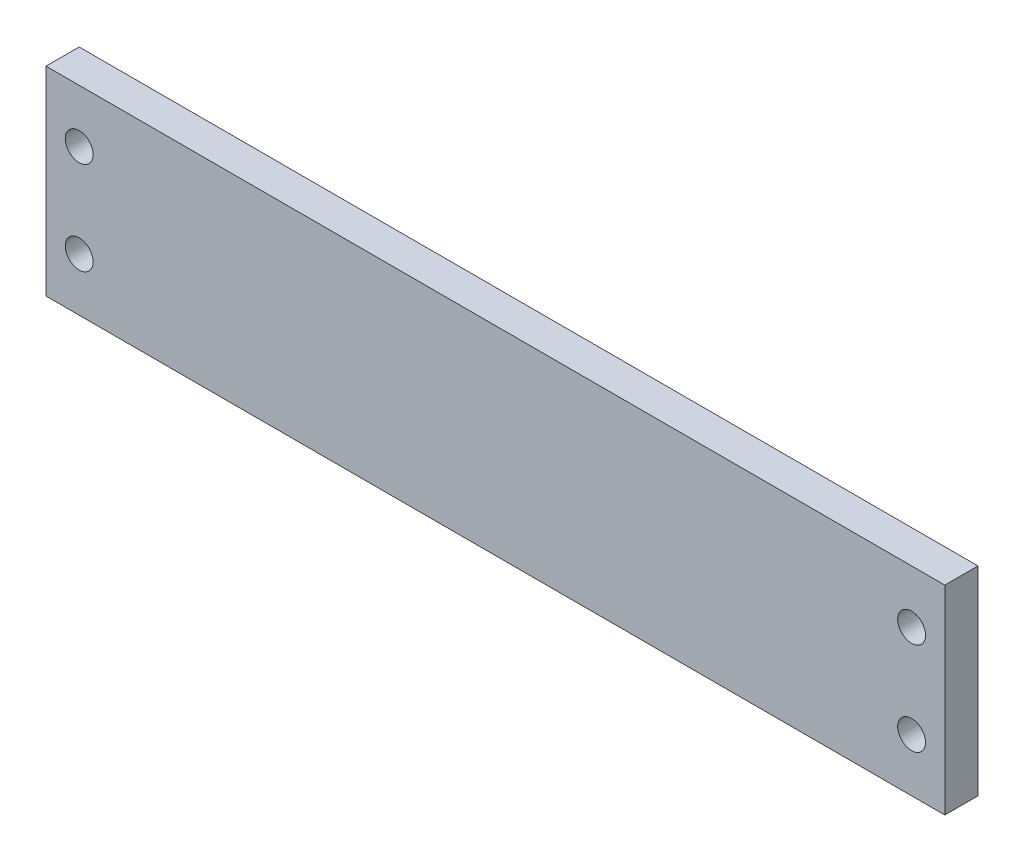
ISO-10303-21;
HEADER;
FILE_DESCRIPTION(('STEP AP214'),'2;1');
FILE_NAME('part.step','',(''),(''),'','','');
FILE_SCHEMA(('AUTOMOTIVE_DESIGN { 1 0 10303 214 1 1 1 1 }'));
ENDSEC;
DATA;
#1=APPLICATION_CONTEXT('core data for automotive mechanical design processes');
#2=APPLICATION_PROTOCOL_DEFINITION('international standard','automotive_design',2000,#1);
#3=PRODUCT_CONTEXT('',#1,'mechanical');
#4=PRODUCT('Part','Part','',(#3));
#5=PRODUCT_RELATED_PRODUCT_CATEGORY('part','',(#4));
#6=PRODUCT_DEFINITION_FORMATION('','',#4);
#7=PRODUCT_DEFINITION_CONTEXT('part definition',#1,'design');
#8=PRODUCT_DEFINITION('design','',#6,#7);
#9=PRODUCT_DEFINITION_SHAPE('','',#8);
#10=(LENGTH_UNIT() NAMED_UNIT(*) SI_UNIT(.MILLI.,.METRE.));
#11=(NAMED_UNIT(*) PLANE_ANGLE_UNIT() SI_UNIT($,.RADIAN.));
#12=(NAMED_UNIT(*) SI_UNIT($,.STERADIAN.) SOLID_ANGLE_UNIT());
#13=UNCERTAINTY_MEASURE_WITH_UNIT(LENGTH_MEASURE(1.E-05),#10,'distance_accuracy_value','');
#14=(GEOMETRIC_REPRESENTATION_CONTEXT(3) GLOBAL_UNCERTAINTY_ASSIGNED_CONTEXT((#13)) GLOBAL_UNIT_ASSIGNED_CONTEXT((#10,
#11,#12)) REPRESENTATION_CONTEXT('',''));
#15=CARTESIAN_POINT('',(0.,0.,0.));
#16=DIRECTION('',(0.,0.,1.));
#17=DIRECTION('',(1.,0.,0.));
#18=AXIS2_PLACEMENT_3D('',#15,#16,#17);
#19=CARTESIAN_POINT('',(0.,30.,5.));
#20=DIRECTION('',(0.,0.,1.));
#21=DIRECTION('',(1.,0.,0.));
#22=AXIS2_PLACEMENT_3D('',#19,#20,#21);
#23=PLANE('',#22);
#24=CARTESIAN_POINT('',(-5.,8.,5.));
#25=DIRECTION('',(0.,0.,1.));
#26=DIRECTION('',(1.,0.,0.));
#27=AXIS2_PLACEMENT_3D('',#24,#25,#26);
#28=CIRCLE('',#27,2.1);
#29=CARTESIAN_POINT('',(-2.9,8.,5.));
#30=VERTEX_POINT('',#29);
#31=EDGE_CURVE('E119',#30,#30,#28,.T.);
#32=ORIENTED_EDGE('',*,*,#31,.F.);
#33=EDGE_LOOP('',(#32));
#34=FACE_BOUND('',#33,.T.);
#35=CARTESIAN_POINT('',(-5.,22.,5.));
#36=DIRECTION('',(0.,0.,1.));
#37=DIRECTION('',(1.,0.,0.));
#38=AXIS2_PLACEMENT_3D('',#35,#36,#37);
#39=CIRCLE('',#38,2.1);
#40=CARTESIAN_POINT('',(-2.9,22.,5.));
#41=VERTEX_POINT('',#40);
#42=EDGE_CURVE('E98',#41,#41,#39,.T.);
#43=ORIENTED_EDGE('',*,*,#42,.F.);
#44=EDGE_LOOP('',(#43));
#45=FACE_BOUND('',#44,.T.);
#46=DIRECTION('',(0.,1.,0.));
#47=VECTOR('',#46,1.);
#48=CARTESIAN_POINT('',(0.,0.,5.));
#49=LINE('',#48,#47);
#50=CARTESIAN_POINT('',(0.,0.,5.));
#51=VERTEX_POINT('',#50);
#52=CARTESIAN_POINT('',(0.,30.,5.));
#53=VERTEX_POINT('',#52);
#54=EDGE_CURVE('E83',#51,#53,#49,.T.);
#55=ORIENTED_EDGE('',*,*,#54,.T.);
#56=DIRECTION('',(-1.,0.,0.));
#57=VECTOR('',#56,1.);
#58=CARTESIAN_POINT('',(0.,30.,5.));
#59=LINE('',#58,#57);
#60=CARTESIAN_POINT('',(-135.42,30.,5.));
#61=VERTEX_POINT('',#60);
#62=EDGE_CURVE('E78',#53,#61,#59,.T.);
#63=ORIENTED_EDGE('',*,*,#62,.T.);
#64=DIRECTION('',(0.,-1.,0.));
#65=VECTOR('',#64,1.);
#66=CARTESIAN_POINT('',(-135.42,0.,5.));
#67=LINE('',#66,#65);
#68=CARTESIAN_POINT('',(-135.42,0.,5.));
#69=VERTEX_POINT('',#68);
#70=EDGE_CURVE('E81',#61,#69,#67,.T.);
#71=ORIENTED_EDGE('',*,*,#70,.T.);
#72=DIRECTION('',(1.,0.,0.));
#73=VECTOR('',#72,1.);
#74=CARTESIAN_POINT('',(0.,0.,5.));
#75=LINE('',#74,#73);
#76=EDGE_CURVE('E48',#69,#51,#75,.T.);
#77=ORIENTED_EDGE('',*,*,#76,.T.);
#78=EDGE_LOOP('',(#55,#63,#71,#77));
#79=FACE_BOUND('',#78,.T.);
#80=CARTESIAN_POINT('',(-130.42,7.99999999999998,5.));
#81=DIRECTION('',(0.,0.,1.));
#82=DIRECTION('',(1.,0.,0.));
#83=AXIS2_PLACEMENT_3D('',#80,#81,#82);
#84=CIRCLE('',#83,2.09999999999999);
#85=CARTESIAN_POINT('',(-128.32,7.99999999999998,5.));
#86=VERTEX_POINT('',#85);
#87=EDGE_CURVE('E113',#86,#86,#84,.T.);
#88=ORIENTED_EDGE('',*,*,#87,.F.);
#89=EDGE_LOOP('',(#88));
#90=FACE_BOUND('',#89,.T.);
#91=CARTESIAN_POINT('',(-130.42,22.,5.));
#92=DIRECTION('',(0.,0.,1.));
#93=DIRECTION('',(1.,0.,0.));
#94=AXIS2_PLACEMENT_3D('',#91,#92,#93);
#95=CIRCLE('',#94,2.09999999999999);
#96=CARTESIAN_POINT('',(-128.32,22.,5.));
#97=VERTEX_POINT('',#96);
#98=EDGE_CURVE('E125',#97,#97,#95,.T.);
#99=ORIENTED_EDGE('',*,*,#98,.F.);
#100=EDGE_LOOP('',(#99));
#101=FACE_BOUND('',#100,.T.);
#102=ADVANCED_FACE('F31',(#34,#45,#79,#90,#101),#23,.T.);
#103=CARTESIAN_POINT('',(0.,30.,0.));
#104=DIRECTION('',(0.,0.,1.));
#105=DIRECTION('',(1.,0.,0.));
#106=AXIS2_PLACEMENT_3D('',#103,#104,#105);
#107=PLANE('',#106);
#108=CARTESIAN_POINT('',(-5.,8.,0.));
#109=DIRECTION('',(0.,0.,1.));
#110=DIRECTION('',(1.,0.,0.));
#111=AXIS2_PLACEMENT_3D('',#108,#109,#110);
#112=CIRCLE('',#111,2.1);
#113=CARTESIAN_POINT('',(-2.9,8.,0.));
#114=VERTEX_POINT('',#113);
#115=EDGE_CURVE('E122',#114,#114,#112,.T.);
#116=ORIENTED_EDGE('',*,*,#115,.T.);
#117=EDGE_LOOP('',(#116));
#118=FACE_BOUND('',#117,.T.);
#119=CARTESIAN_POINT('',(-5.,22.,0.));
#120=DIRECTION('',(0.,0.,1.));
#121=DIRECTION('',(1.,0.,0.));
#122=AXIS2_PLACEMENT_3D('',#119,#120,#121);
#123=CIRCLE('',#122,2.1);
#124=CARTESIAN_POINT('',(-2.9,22.,0.));
#125=VERTEX_POINT('',#124);
#126=EDGE_CURVE('E110',#125,#125,#123,.T.);
#127=ORIENTED_EDGE('',*,*,#126,.T.);
#128=EDGE_LOOP('',(#127));
#129=FACE_BOUND('',#128,.T.);
#130=DIRECTION('',(0.,1.,0.));
#131=VECTOR('',#130,1.);
#132=CARTESIAN_POINT('',(0.,0.,0.));
#133=LINE('',#132,#131);
#134=CARTESIAN_POINT('',(0.,0.,0.));
#135=VERTEX_POINT('',#134);
#136=CARTESIAN_POINT('',(0.,30.,0.));
#137=VERTEX_POINT('',#136);
#138=EDGE_CURVE('E95',#135,#137,#133,.T.);
#139=ORIENTED_EDGE('',*,*,#138,.F.);
#140=DIRECTION('',(1.,0.,0.));
#141=VECTOR('',#140,1.);
#142=CARTESIAN_POINT('',(0.,0.,0.));
#143=LINE('',#142,#141);
#144=CARTESIAN_POINT('',(-135.42,0.,0.));
#145=VERTEX_POINT('',#144);
#146=EDGE_CURVE('E71',#145,#135,#143,.T.);
#147=ORIENTED_EDGE('',*,*,#146,.F.);
#148=DIRECTION('',(0.,-1.,0.));
#149=VECTOR('',#148,1.);
#150=CARTESIAN_POINT('',(-135.42,0.,0.));
#151=LINE('',#150,#149);
#152=CARTESIAN_POINT('',(-135.42,30.,0.));
#153=VERTEX_POINT('',#152);
#154=EDGE_CURVE('E65',#153,#145,#151,.T.);
#155=ORIENTED_EDGE('',*,*,#154,.F.);
#156=DIRECTION('',(-1.,0.,0.));
#157=VECTOR('',#156,1.);
#158=CARTESIAN_POINT('',(0.,30.,0.));
#159=LINE('',#158,#157);
#160=EDGE_CURVE('E87',#137,#153,#159,.T.);
#161=ORIENTED_EDGE('',*,*,#160,.F.);
#162=EDGE_LOOP('',(#139,#147,#155,#161));
#163=FACE_BOUND('',#162,.T.);
#164=CARTESIAN_POINT('',(-130.42,7.99999999999998,0.));
#165=DIRECTION('',(0.,0.,1.));
#166=DIRECTION('',(1.,0.,0.));
#167=AXIS2_PLACEMENT_3D('',#164,#165,#166);
#168=CIRCLE('',#167,2.09999999999999);
#169=CARTESIAN_POINT('',(-128.32,7.99999999999998,0.));
#170=VERTEX_POINT('',#169);
#171=EDGE_CURVE('E116',#170,#170,#168,.T.);
#172=ORIENTED_EDGE('',*,*,#171,.T.);
#173=EDGE_LOOP('',(#172));
#174=FACE_BOUND('',#173,.T.);
#175=CARTESIAN_POINT('',(-130.42,22.,0.));
#176=DIRECTION('',(0.,0.,1.));
#177=DIRECTION('',(1.,0.,0.));
#178=AXIS2_PLACEMENT_3D('',#175,#176,#177);
#179=CIRCLE('',#178,2.09999999999999);
#180=CARTESIAN_POINT('',(-128.32,22.,0.));
#181=VERTEX_POINT('',#180);
#182=EDGE_CURVE('E128',#181,#181,#179,.T.);
#183=ORIENTED_EDGE('',*,*,#182,.T.);
#184=EDGE_LOOP('',(#183));
#185=FACE_BOUND('',#184,.T.);
#186=ADVANCED_FACE('F106',(#118,#129,#163,#174,#185),#107,.F.);
#187=CARTESIAN_POINT('',(0.,0.,5.));
#188=DIRECTION('',(-1.,0.,0.));
#189=DIRECTION('',(0.,-1.,0.));
#190=AXIS2_PLACEMENT_3D('',#187,#188,#189);
#191=PLANE('',#190);
#192=ORIENTED_EDGE('',*,*,#138,.T.);
#193=DIRECTION('',(0.,0.,-1.));
#194=VECTOR('',#193,1.);
#195=CARTESIAN_POINT('',(0.,30.,5.));
#196=LINE('',#195,#194);
#197=EDGE_CURVE('E11',#53,#137,#196,.T.);
#198=ORIENTED_EDGE('',*,*,#197,.F.);
#199=ORIENTED_EDGE('',*,*,#54,.F.);
#200=DIRECTION('',(0.,0.,-1.));
#201=VECTOR('',#200,1.);
#202=CARTESIAN_POINT('',(0.,0.,5.));
#203=LINE('',#202,#201);
#204=EDGE_CURVE('E91',#51,#135,#203,.T.);
#205=ORIENTED_EDGE('',*,*,#204,.T.);
#206=EDGE_LOOP('',(#192,#198,#199,#205));
#207=FACE_BOUND('',#206,.T.);
#208=ADVANCED_FACE('F33',(#207),#191,.F.);
#209=CARTESIAN_POINT('',(0.,30.,5.));
#210=DIRECTION('',(0.,-1.,0.));
#211=DIRECTION('',(1.,0.,0.));
#212=AXIS2_PLACEMENT_3D('',#209,#210,#211);
#213=PLANE('',#212);
#214=ORIENTED_EDGE('',*,*,#160,.T.);
#215=DIRECTION('',(0.,0.,-1.));
#216=VECTOR('',#215,1.);
#217=CARTESIAN_POINT('',(-135.42,30.,5.));
#218=LINE('',#217,#216);
#219=EDGE_CURVE('E40',#61,#153,#218,.T.);
#220=ORIENTED_EDGE('',*,*,#219,.F.);
#221=ORIENTED_EDGE('',*,*,#62,.F.);
#222=ORIENTED_EDGE('',*,*,#197,.T.);
#223=EDGE_LOOP('',(#214,#220,#221,#222));
#224=FACE_BOUND('',#223,.T.);
#225=ADVANCED_FACE('F86',(#224),#213,.F.);
#226=CARTESIAN_POINT('',(-135.42,0.,5.));
#227=DIRECTION('',(1.,0.,0.));
#228=DIRECTION('',(0.,0.,-1.));
#229=AXIS2_PLACEMENT_3D('',#226,#227,#228);
#230=PLANE('',#229);
#231=ORIENTED_EDGE('',*,*,#154,.T.);
#232=DIRECTION('',(0.,0.,-1.));
#233=VECTOR('',#232,1.);
#234=CARTESIAN_POINT('',(-135.42,0.,5.));
#235=LINE('',#234,#233);
#236=EDGE_CURVE('E88',#69,#145,#235,.T.);
#237=ORIENTED_EDGE('',*,*,#236,.F.);
#238=ORIENTED_EDGE('',*,*,#70,.F.);
#239=ORIENTED_EDGE('',*,*,#219,.T.);
#240=EDGE_LOOP('',(#231,#237,#238,#239));
#241=FACE_BOUND('',#240,.T.);
#242=ADVANCED_FACE('F89',(#241),#230,.F.);
#243=CARTESIAN_POINT('',(0.,0.,5.));
#244=DIRECTION('',(0.,1.,0.));
#245=DIRECTION('',(-1.,0.,0.));
#246=AXIS2_PLACEMENT_3D('',#243,#244,#245);
#247=PLANE('',#246);
#248=ORIENTED_EDGE('',*,*,#146,.T.);
#249=ORIENTED_EDGE('',*,*,#204,.F.);
#250=ORIENTED_EDGE('',*,*,#76,.F.);
#251=ORIENTED_EDGE('',*,*,#236,.T.);
#252=EDGE_LOOP('',(#248,#249,#250,#251));
#253=FACE_BOUND('',#252,.T.);
#254=ADVANCED_FACE('F103',(#253),#247,.F.);
#255=CARTESIAN_POINT('',(-5.,22.,5.));
#256=DIRECTION('',(0.,0.,-1.));
#257=DIRECTION('',(-1.,0.,0.));
#258=AXIS2_PLACEMENT_3D('',#255,#256,#257);
#259=CYLINDRICAL_SURFACE('',#258,2.1);
#260=ORIENTED_EDGE('',*,*,#42,.T.);
#261=EDGE_LOOP('',(#260));
#262=FACE_BOUND('',#261,.T.);
#263=ORIENTED_EDGE('',*,*,#126,.F.);
#264=EDGE_LOOP('',(#263));
#265=FACE_BOUND('',#264,.T.);
#266=ADVANCED_FACE('F148',(#262,#265),#259,.F.);
#267=CARTESIAN_POINT('',(-130.42,7.99999999999998,5.));
#268=DIRECTION('',(0.,0.,-1.));
#269=DIRECTION('',(-1.,0.,0.));
#270=AXIS2_PLACEMENT_3D('',#267,#268,#269);
#271=CYLINDRICAL_SURFACE('',#270,2.09999999999999);
#272=ORIENTED_EDGE('',*,*,#87,.T.);
#273=EDGE_LOOP('',(#272));
#274=FACE_BOUND('',#273,.T.);
#275=ORIENTED_EDGE('',*,*,#171,.F.);
#276=EDGE_LOOP('',(#275));
#277=FACE_BOUND('',#276,.T.);
#278=ADVANCED_FACE('F194',(#274,#277),#271,.F.);
#279=CARTESIAN_POINT('',(-5.,8.,5.));
#280=DIRECTION('',(0.,0.,-1.));
#281=DIRECTION('',(-1.,0.,0.));
#282=AXIS2_PLACEMENT_3D('',#279,#280,#281);
#283=CYLINDRICAL_SURFACE('',#282,2.1);
#284=ORIENTED_EDGE('',*,*,#31,.T.);
#285=EDGE_LOOP('',(#284));
#286=FACE_BOUND('',#285,.T.);
#287=ORIENTED_EDGE('',*,*,#115,.F.);
#288=EDGE_LOOP('',(#287));
#289=FACE_BOUND('',#288,.T.);
#290=ADVANCED_FACE('F202',(#286,#289),#283,.F.);
#291=CARTESIAN_POINT('',(-130.42,22.,5.));
#292=DIRECTION('',(0.,0.,-1.));
#293=DIRECTION('',(-1.,0.,0.));
#294=AXIS2_PLACEMENT_3D('',#291,#292,#293);
#295=CYLINDRICAL_SURFACE('',#294,2.09999999999999);
#296=ORIENTED_EDGE('',*,*,#98,.T.);
#297=EDGE_LOOP('',(#296));
#298=FACE_BOUND('',#297,.T.);
#299=ORIENTED_EDGE('',*,*,#182,.F.);
#300=EDGE_LOOP('',(#299));
#301=FACE_BOUND('',#300,.T.);
#302=ADVANCED_FACE('F134',(#298,#301),#295,.F.);
#303=CLOSED_SHELL('',(#102,#186,#208,#225,#242,#254,#266,#278,#290,#302));
#304=MANIFOLD_SOLID_BREP('B2',#303);
#305=ADVANCED_BREP_SHAPE_REPRESENTATION('',(#18,#304),#14);
#306=SHAPE_DEFINITION_REPRESENTATION(#9,#305);
ENDSEC;
END-ISO-10303-21;
